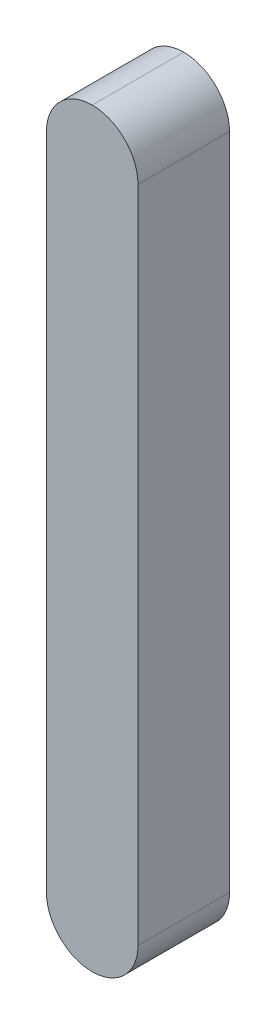
ISO-10303-21;
HEADER;
FILE_DESCRIPTION(('STEP AP214'),'2;1');
FILE_NAME('part.step','',(''),(''),'','','');
FILE_SCHEMA(('AUTOMOTIVE_DESIGN { 1 0 10303 214 1 1 1 1 }'));
ENDSEC;
DATA;
#1=APPLICATION_CONTEXT('core data for automotive mechanical design processes');
#2=APPLICATION_PROTOCOL_DEFINITION('international standard','automotive_design',2000,#1);
#3=PRODUCT_CONTEXT('',#1,'mechanical');
#4=PRODUCT('Part','Part','',(#3));
#5=PRODUCT_RELATED_PRODUCT_CATEGORY('part','',(#4));
#6=PRODUCT_DEFINITION_FORMATION('','',#4);
#7=PRODUCT_DEFINITION_CONTEXT('part definition',#1,'design');
#8=PRODUCT_DEFINITION('design','',#6,#7);
#9=PRODUCT_DEFINITION_SHAPE('','',#8);
#10=(LENGTH_UNIT() NAMED_UNIT(*) SI_UNIT(.MILLI.,.METRE.));
#11=(NAMED_UNIT(*) PLANE_ANGLE_UNIT() SI_UNIT($,.RADIAN.));
#12=(NAMED_UNIT(*) SI_UNIT($,.STERADIAN.) SOLID_ANGLE_UNIT());
#13=UNCERTAINTY_MEASURE_WITH_UNIT(LENGTH_MEASURE(1.E-05),#10,'distance_accuracy_value','');
#14=(GEOMETRIC_REPRESENTATION_CONTEXT(3) GLOBAL_UNCERTAINTY_ASSIGNED_CONTEXT((#13)) GLOBAL_UNIT_ASSIGNED_CONTEXT((#10,
#11,#12)) REPRESENTATION_CONTEXT('',''));
#15=CARTESIAN_POINT('',(0.,0.,0.));
#16=DIRECTION('',(0.,0.,1.));
#17=DIRECTION('',(1.,0.,0.));
#18=AXIS2_PLACEMENT_3D('',#15,#16,#17);
#19=CARTESIAN_POINT('',(2.5,20.5,-2.5));
#20=DIRECTION('',(-1.,0.,0.));
#21=DIRECTION('',(0.,0.,1.));
#22=AXIS2_PLACEMENT_3D('',#19,#20,#21);
#23=PLANE('',#22);
#24=DIRECTION('',(0.,-1.,0.));
#25=VECTOR('',#24,1.);
#26=CARTESIAN_POINT('',(2.5,20.5,2.5));
#27=LINE('',#26,#25);
#28=CARTESIAN_POINT('',(2.5,18.,2.5));
#29=VERTEX_POINT('',#28);
#30=CARTESIAN_POINT('',(2.5,-18.,2.5));
#31=VERTEX_POINT('',#30);
#32=EDGE_CURVE('E109',#29,#31,#27,.T.);
#33=ORIENTED_EDGE('',*,*,#32,.T.);
#34=DIRECTION('',(0.,0.,-1.));
#35=VECTOR('',#34,1.);
#36=CARTESIAN_POINT('',(2.5,-18.,-2.5));
#37=LINE('',#36,#35);
#38=CARTESIAN_POINT('',(2.5,-18.,-2.5));
#39=VERTEX_POINT('',#38);
#40=EDGE_CURVE('E11',#31,#39,#37,.T.);
#41=ORIENTED_EDGE('',*,*,#40,.T.);
#42=DIRECTION('',(0.,-1.,0.));
#43=VECTOR('',#42,1.);
#44=CARTESIAN_POINT('',(2.5,20.5,-2.5));
#45=LINE('',#44,#43);
#46=CARTESIAN_POINT('',(2.5,18.,-2.5));
#47=VERTEX_POINT('',#46);
#48=EDGE_CURVE('E113',#47,#39,#45,.T.);
#49=ORIENTED_EDGE('',*,*,#48,.F.);
#50=DIRECTION('',(0.,0.,-1.));
#51=VECTOR('',#50,1.);
#52=CARTESIAN_POINT('',(2.5,18.,2.5));
#53=LINE('',#52,#51);
#54=EDGE_CURVE('E44',#47,#29,#53,.F.);
#55=ORIENTED_EDGE('',*,*,#54,.T.);
#56=EDGE_LOOP('',(#33,#41,#49,#55));
#57=FACE_BOUND('',#56,.T.);
#58=ADVANCED_FACE('F35',(#57),#23,.F.);
#59=CARTESIAN_POINT('',(-2.5,20.5,-2.5));
#60=DIRECTION('',(0.,0.,1.));
#61=DIRECTION('',(1.,0.,0.));
#62=AXIS2_PLACEMENT_3D('',#59,#60,#61);
#63=PLANE('',#62);
#64=CARTESIAN_POINT('',(0.,-18.,-2.5));
#65=DIRECTION('',(0.,0.,1.));
#66=DIRECTION('',(1.,0.,0.));
#67=AXIS2_PLACEMENT_3D('',#64,#65,#66);
#68=CIRCLE('',#67,2.5);
#69=CARTESIAN_POINT('',(0.,-20.5,-2.5));
#70=VERTEX_POINT('',#69);
#71=EDGE_CURVE('E126',#39,#70,#68,.F.);
#72=ORIENTED_EDGE('',*,*,#71,.T.);
#73=CARTESIAN_POINT('',(0.,-18.,-2.5));
#74=DIRECTION('',(0.,0.,1.));
#75=DIRECTION('',(1.,0.,0.));
#76=AXIS2_PLACEMENT_3D('',#73,#74,#75);
#77=CIRCLE('',#76,2.5);
#78=CARTESIAN_POINT('',(-2.5,-18.,-2.5));
#79=VERTEX_POINT('',#78);
#80=EDGE_CURVE('E128',#70,#79,#77,.F.);
#81=ORIENTED_EDGE('',*,*,#80,.T.);
#82=DIRECTION('',(0.,-1.,0.));
#83=VECTOR('',#82,1.);
#84=CARTESIAN_POINT('',(-2.5,20.5,-2.5));
#85=LINE('',#84,#83);
#86=CARTESIAN_POINT('',(-2.5,18.,-2.5));
#87=VERTEX_POINT('',#86);
#88=EDGE_CURVE('E108',#87,#79,#85,.T.);
#89=ORIENTED_EDGE('',*,*,#88,.F.);
#90=CARTESIAN_POINT('',(0.,18.,-2.5));
#91=DIRECTION('',(0.,0.,1.));
#92=DIRECTION('',(1.,0.,0.));
#93=AXIS2_PLACEMENT_3D('',#90,#91,#92);
#94=CIRCLE('',#93,2.5);
#95=CARTESIAN_POINT('',(0.,20.5,-2.5));
#96=VERTEX_POINT('',#95);
#97=EDGE_CURVE('E112',#87,#96,#94,.F.);
#98=ORIENTED_EDGE('',*,*,#97,.T.);
#99=CARTESIAN_POINT('',(0.,18.,-2.5));
#100=DIRECTION('',(0.,0.,1.));
#101=DIRECTION('',(1.,0.,0.));
#102=AXIS2_PLACEMENT_3D('',#99,#100,#101);
#103=CIRCLE('',#102,2.5);
#104=EDGE_CURVE('E57',#96,#47,#103,.F.);
#105=ORIENTED_EDGE('',*,*,#104,.T.);
#106=ORIENTED_EDGE('',*,*,#48,.T.);
#107=EDGE_LOOP('',(#72,#81,#89,#98,#105,#106));
#108=FACE_BOUND('',#107,.T.);
#109=ADVANCED_FACE('F144',(#108),#63,.F.);
#110=CARTESIAN_POINT('',(-2.5,20.5,-2.5));
#111=DIRECTION('',(1.,0.,0.));
#112=DIRECTION('',(0.,0.,-1.));
#113=AXIS2_PLACEMENT_3D('',#110,#111,#112);
#114=PLANE('',#113);
#115=ORIENTED_EDGE('',*,*,#88,.T.);
#116=DIRECTION('',(0.,0.,1.));
#117=VECTOR('',#116,1.);
#118=CARTESIAN_POINT('',(-2.5,-18.,-2.5));
#119=LINE('',#118,#117);
#120=CARTESIAN_POINT('',(-2.5,-18.,2.5));
#121=VERTEX_POINT('',#120);
#122=EDGE_CURVE('E99',#79,#121,#119,.T.);
#123=ORIENTED_EDGE('',*,*,#122,.T.);
#124=DIRECTION('',(0.,-1.,0.));
#125=VECTOR('',#124,1.);
#126=CARTESIAN_POINT('',(-2.5,20.5,2.5));
#127=LINE('',#126,#125);
#128=CARTESIAN_POINT('',(-2.5,18.,2.5));
#129=VERTEX_POINT('',#128);
#130=EDGE_CURVE('E92',#129,#121,#127,.T.);
#131=ORIENTED_EDGE('',*,*,#130,.F.);
#132=DIRECTION('',(0.,0.,1.));
#133=VECTOR('',#132,1.);
#134=CARTESIAN_POINT('',(-2.5,18.,-2.5));
#135=LINE('',#134,#133);
#136=EDGE_CURVE('E105',#129,#87,#135,.F.);
#137=ORIENTED_EDGE('',*,*,#136,.T.);
#138=EDGE_LOOP('',(#115,#123,#131,#137));
#139=FACE_BOUND('',#138,.T.);
#140=ADVANCED_FACE('F104',(#139),#114,.F.);
#141=CARTESIAN_POINT('',(-2.5,20.5,2.5));
#142=DIRECTION('',(0.,0.,-1.));
#143=DIRECTION('',(-1.,0.,0.));
#144=AXIS2_PLACEMENT_3D('',#141,#142,#143);
#145=PLANE('',#144);
#146=ORIENTED_EDGE('',*,*,#130,.T.);
#147=CARTESIAN_POINT('',(0.,-18.,2.5));
#148=DIRECTION('',(0.,0.,-1.));
#149=DIRECTION('',(-1.,0.,0.));
#150=AXIS2_PLACEMENT_3D('',#147,#148,#149);
#151=CIRCLE('',#150,2.5);
#152=CARTESIAN_POINT('',(0.,-20.5,2.5));
#153=VERTEX_POINT('',#152);
#154=EDGE_CURVE('E122',#121,#153,#151,.F.);
#155=ORIENTED_EDGE('',*,*,#154,.T.);
#156=CARTESIAN_POINT('',(0.,-18.,2.5));
#157=DIRECTION('',(0.,0.,-1.));
#158=DIRECTION('',(-1.,0.,0.));
#159=AXIS2_PLACEMENT_3D('',#156,#157,#158);
#160=CIRCLE('',#159,2.5);
#161=EDGE_CURVE('E120',#153,#31,#160,.F.);
#162=ORIENTED_EDGE('',*,*,#161,.T.);
#163=ORIENTED_EDGE('',*,*,#32,.F.);
#164=CARTESIAN_POINT('',(0.,18.,2.5));
#165=DIRECTION('',(0.,0.,-1.));
#166=DIRECTION('',(-1.,0.,0.));
#167=AXIS2_PLACEMENT_3D('',#164,#165,#166);
#168=CIRCLE('',#167,2.5);
#169=CARTESIAN_POINT('',(0.,20.5,2.5));
#170=VERTEX_POINT('',#169);
#171=EDGE_CURVE('E94',#29,#170,#168,.F.);
#172=ORIENTED_EDGE('',*,*,#171,.T.);
#173=CARTESIAN_POINT('',(0.,18.,2.5));
#174=DIRECTION('',(0.,0.,-1.));
#175=DIRECTION('',(-1.,0.,0.));
#176=AXIS2_PLACEMENT_3D('',#173,#174,#175);
#177=CIRCLE('',#176,2.5);
#178=EDGE_CURVE('E89',#170,#129,#177,.F.);
#179=ORIENTED_EDGE('',*,*,#178,.T.);
#180=EDGE_LOOP('',(#146,#155,#162,#163,#172,#179));
#181=FACE_BOUND('',#180,.T.);
#182=ADVANCED_FACE('F91',(#181),#145,.F.);
#183=CARTESIAN_POINT('',(0.,-18.,-2.5));
#184=DIRECTION('',(0.,0.,-1.));
#185=DIRECTION('',(-1.,0.,0.));
#186=AXIS2_PLACEMENT_3D('',#183,#184,#185);
#187=CYLINDRICAL_SURFACE('',#186,2.5);
#188=DIRECTION('',(0.,0.,-1.));
#189=VECTOR('',#188,1.);
#190=CARTESIAN_POINT('',(0.,-20.5,0.));
#191=LINE('',#190,#189);
#192=EDGE_CURVE('E131',#70,#153,#191,.F.);
#193=ORIENTED_EDGE('',*,*,#192,.F.);
#194=ORIENTED_EDGE('',*,*,#71,.F.);
#195=ORIENTED_EDGE('',*,*,#40,.F.);
#196=ORIENTED_EDGE('',*,*,#161,.F.);
#197=EDGE_LOOP('',(#193,#194,#195,#196));
#198=FACE_BOUND('',#197,.T.);
#199=ADVANCED_FACE('F142',(#198),#187,.T.);
#200=CARTESIAN_POINT('',(0.,-18.,-2.5));
#201=DIRECTION('',(0.,0.,1.));
#202=DIRECTION('',(1.,0.,0.));
#203=AXIS2_PLACEMENT_3D('',#200,#201,#202);
#204=CYLINDRICAL_SURFACE('',#203,2.5);
#205=ORIENTED_EDGE('',*,*,#80,.F.);
#206=ORIENTED_EDGE('',*,*,#192,.T.);
#207=ORIENTED_EDGE('',*,*,#154,.F.);
#208=ORIENTED_EDGE('',*,*,#122,.F.);
#209=EDGE_LOOP('',(#205,#206,#207,#208));
#210=FACE_BOUND('',#209,.T.);
#211=ADVANCED_FACE('F145',(#210),#204,.T.);
#212=CARTESIAN_POINT('',(0.,18.,0.));
#213=DIRECTION('',(0.,0.,-1.));
#214=DIRECTION('',(-1.,0.,0.));
#215=AXIS2_PLACEMENT_3D('',#212,#213,#214);
#216=CYLINDRICAL_SURFACE('',#215,2.5);
#217=ORIENTED_EDGE('',*,*,#136,.F.);
#218=ORIENTED_EDGE('',*,*,#178,.F.);
#219=DIRECTION('',(0.,0.,1.));
#220=VECTOR('',#219,1.);
#221=CARTESIAN_POINT('',(0.,20.5,2.5));
#222=LINE('',#221,#220);
#223=EDGE_CURVE('E39',#96,#170,#222,.T.);
#224=ORIENTED_EDGE('',*,*,#223,.F.);
#225=ORIENTED_EDGE('',*,*,#97,.F.);
#226=EDGE_LOOP('',(#217,#218,#224,#225));
#227=FACE_BOUND('',#226,.T.);
#228=ADVANCED_FACE('F37',(#227),#216,.T.);
#229=CARTESIAN_POINT('',(0.,18.,0.));
#230=DIRECTION('',(0.,0.,1.));
#231=DIRECTION('',(1.,0.,0.));
#232=AXIS2_PLACEMENT_3D('',#229,#230,#231);
#233=CYLINDRICAL_SURFACE('',#232,2.5);
#234=ORIENTED_EDGE('',*,*,#171,.F.);
#235=ORIENTED_EDGE('',*,*,#54,.F.);
#236=ORIENTED_EDGE('',*,*,#104,.F.);
#237=ORIENTED_EDGE('',*,*,#223,.T.);
#238=EDGE_LOOP('',(#234,#235,#236,#237));
#239=FACE_BOUND('',#238,.T.);
#240=ADVANCED_FACE('F138',(#239),#233,.T.);
#241=CLOSED_SHELL('',(#58,#109,#140,#182,#199,#211,#228,#240));
#242=MANIFOLD_SOLID_BREP('B2',#241);
#243=ADVANCED_BREP_SHAPE_REPRESENTATION('',(#18,#242),#14);
#244=SHAPE_DEFINITION_REPRESENTATION(#9,#243);
ENDSEC;
END-ISO-10303-21;
